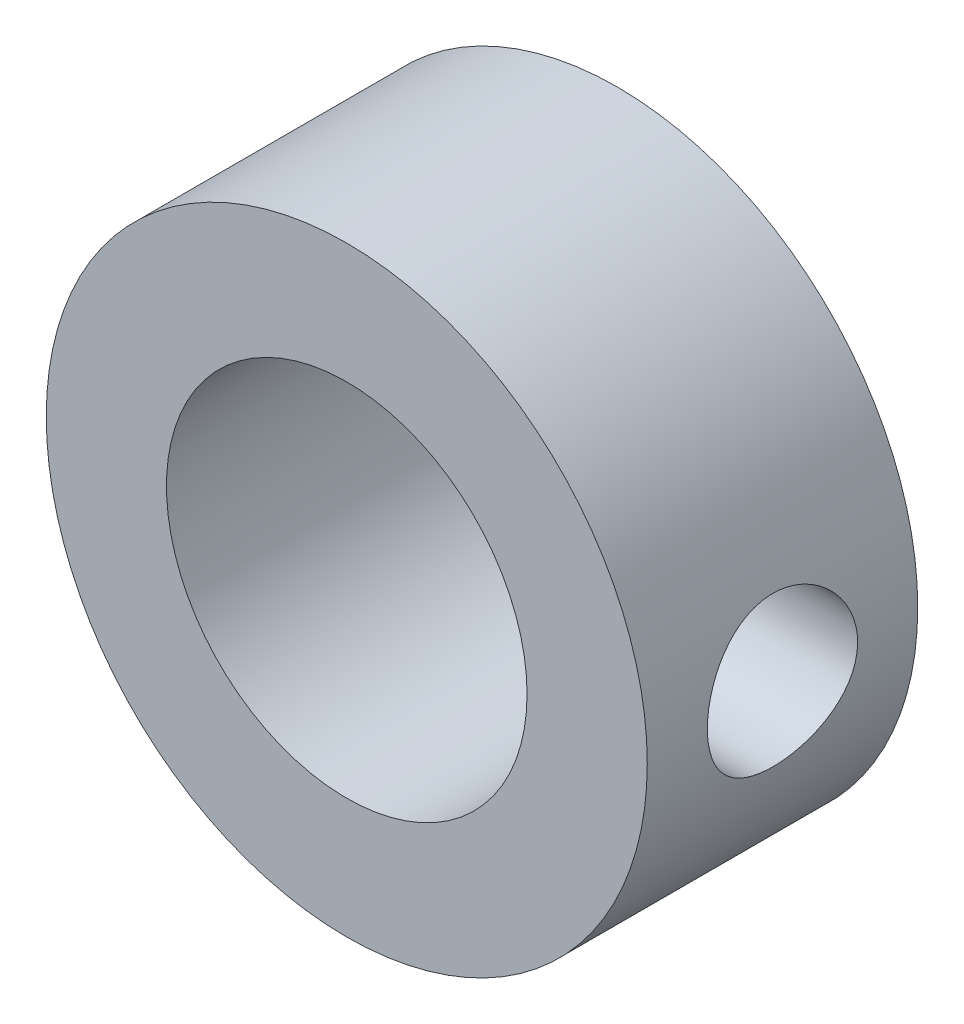
ISO-10303-21;
HEADER;
FILE_DESCRIPTION(('STEP AP214'),'2;1');
FILE_NAME('part.step','',(''),(''),'','','');
FILE_SCHEMA(('AUTOMOTIVE_DESIGN { 1 0 10303 214 1 1 1 1 }'));
ENDSEC;
DATA;
#1=APPLICATION_CONTEXT('core data for automotive mechanical design processes');
#2=APPLICATION_PROTOCOL_DEFINITION('international standard','automotive_design',2000,#1);
#3=PRODUCT_CONTEXT('',#1,'mechanical');
#4=PRODUCT('Part','Part','',(#3));
#5=PRODUCT_RELATED_PRODUCT_CATEGORY('part','',(#4));
#6=PRODUCT_DEFINITION_FORMATION('','',#4);
#7=PRODUCT_DEFINITION_CONTEXT('part definition',#1,'design');
#8=PRODUCT_DEFINITION('design','',#6,#7);
#9=PRODUCT_DEFINITION_SHAPE('','',#8);
#10=(LENGTH_UNIT() NAMED_UNIT(*) SI_UNIT(.MILLI.,.METRE.));
#11=(NAMED_UNIT(*) PLANE_ANGLE_UNIT() SI_UNIT($,.RADIAN.));
#12=(NAMED_UNIT(*) SI_UNIT($,.STERADIAN.) SOLID_ANGLE_UNIT());
#13=UNCERTAINTY_MEASURE_WITH_UNIT(LENGTH_MEASURE(1.E-05),#10,'distance_accuracy_value','');
#14=(GEOMETRIC_REPRESENTATION_CONTEXT(3) GLOBAL_UNCERTAINTY_ASSIGNED_CONTEXT((#13)) GLOBAL_UNIT_ASSIGNED_CONTEXT((#10,
#11,#12)) REPRESENTATION_CONTEXT('',''));
#15=CARTESIAN_POINT('',(0.,0.,0.));
#16=DIRECTION('',(0.,0.,1.));
#17=DIRECTION('',(1.,0.,0.));
#18=AXIS2_PLACEMENT_3D('',#15,#16,#17);
#19=CARTESIAN_POINT('',(0.,0.,0.));
#20=DIRECTION('',(0.,0.,-1.));
#21=DIRECTION('',(-1.,0.,0.));
#22=AXIS2_PLACEMENT_3D('',#19,#20,#21);
#23=PLANE('',#22);
#24=CARTESIAN_POINT('',(0.,0.,0.));
#25=DIRECTION('',(0.,0.,1.));
#26=DIRECTION('',(1.,0.,0.));
#27=AXIS2_PLACEMENT_3D('',#24,#25,#26);
#28=CIRCLE('',#27,9.525);
#29=CARTESIAN_POINT('',(9.52500000000004,0.,0.));
#30=VERTEX_POINT('',#29);
#31=EDGE_CURVE('E48',#30,#30,#28,.T.);
#32=ORIENTED_EDGE('',*,*,#31,.F.);
#33=EDGE_LOOP('',(#32));
#34=FACE_BOUND('',#33,.T.);
#35=CARTESIAN_POINT('',(0.,0.,0.));
#36=DIRECTION('',(0.,0.,1.));
#37=DIRECTION('',(1.,0.,0.));
#38=AXIS2_PLACEMENT_3D('',#35,#36,#37);
#39=CIRCLE('',#38,15.875);
#40=CARTESIAN_POINT('',(15.8750000000001,0.,0.));
#41=VERTEX_POINT('',#40);
#42=EDGE_CURVE('E10',#41,#41,#39,.T.);
#43=ORIENTED_EDGE('',*,*,#42,.T.);
#44=EDGE_LOOP('',(#43));
#45=FACE_BOUND('',#44,.T.);
#46=ADVANCED_FACE('F34',(#34,#45),#23,.F.);
#47=CARTESIAN_POINT('',(0.,0.,-3.30291349825984E-12));
#48=DIRECTION('',(0.,0.,1.));
#49=DIRECTION('',(1.,0.,0.));
#50=AXIS2_PLACEMENT_3D('',#47,#48,#49);
#51=CYLINDRICAL_SURFACE('',#50,15.875);
#52=CARTESIAN_POINT('',(15.875,0.,-11.11275));
#53=CARTESIAN_POINT('',(15.8749962923412,-0.21927631793862,-11.1127438464845));
#54=CARTESIAN_POINT('',(15.8704115464046,-0.438621375927201,-11.0945161052443));
#55=CARTESIAN_POINT('',(15.8525663450826,-0.87102506497622,-11.0221959538335));
#56=CARTESIAN_POINT('',(15.8393009725702,-1.08408006151221,-10.9680832164311));
#57=CARTESIAN_POINT('',(15.8055634467017,-1.49759689098311,-10.8258378085482));
#58=CARTESIAN_POINT('',(15.7850999501961,-1.69807351157523,-10.7377459908992));
#59=CARTESIAN_POINT('',(15.73914555491,-2.08140334899713,-10.5301867388397));
#60=CARTESIAN_POINT('',(15.7136544865579,-2.26425597108945,-10.4107182461019));
#61=CARTESIAN_POINT('',(15.6598253179469,-2.61091343265034,-10.1411979107066));
#62=CARTESIAN_POINT('',(15.6314432932942,-2.77430359661984,-9.99062145792078));
#63=CARTESIAN_POINT('',(15.5753228656204,-3.07379403655877,-9.66428270784481));
#64=CARTESIAN_POINT('',(15.5475845355861,-3.20989123109479,-9.48851757053623));
#65=CARTESIAN_POINT('',(15.4954492736808,-3.45288272782232,-9.11357096259172));
#66=CARTESIAN_POINT('',(15.4711081035481,-3.55931315463522,-8.91408041015188));
#67=CARTESIAN_POINT('',(15.42916371706,-3.73696682054045,-8.49933232748279));
#68=CARTESIAN_POINT('',(15.4115594235815,-3.80819568835206,-8.28407732430904));
#69=CARTESIAN_POINT('',(15.3855334459236,-3.91200967237928,-7.84847032767479));
#70=CARTESIAN_POINT('',(15.3769348659626,-3.94534037662848,-7.62830683756615));
#71=CARTESIAN_POINT('',(15.3693643817434,-3.97473427986315,-7.18535816118923));
#72=CARTESIAN_POINT('',(15.3703909113223,-3.97080354189381,-6.96257340733539));
#73=CARTESIAN_POINT('',(15.3817956459658,-3.92638101310927,-6.52642067534044));
#74=CARTESIAN_POINT('',(15.3919465837346,-3.88677769175432,-6.31295533487303));
#75=CARTESIAN_POINT('',(15.4200941933804,-3.7735514945141,-5.8957988861312));
#76=CARTESIAN_POINT('',(15.4380914241862,-3.69992619505865,-5.69210847531932));
#77=CARTESIAN_POINT('',(15.4801123887539,-3.5199888270422,-5.29790149866626));
#78=CARTESIAN_POINT('',(15.5041951226389,-3.41335430705373,-5.1075386704735));
#79=CARTESIAN_POINT('',(15.5556402661335,-3.1706509802895,-4.74709008043514));
#80=CARTESIAN_POINT('',(15.5830032492704,-3.03457702289009,-4.57700787490541));
#81=CARTESIAN_POINT('',(15.638882672618,-2.73225531113579,-4.25685710014189));
#82=CARTESIAN_POINT('',(15.6674097549388,-2.56525780806384,-4.10749749504606));
#83=CARTESIAN_POINT('',(15.7216995059379,-2.2082440317285,-3.83876879598098));
#84=CARTESIAN_POINT('',(15.7474620901615,-2.01822705560227,-3.71940061809433));
#85=CARTESIAN_POINT('',(15.7934483283255,-1.6195566221362,-3.51378282394798));
#86=CARTESIAN_POINT('',(15.8136526533794,-1.41084139453116,-3.42764837057687));
#87=CARTESIAN_POINT('',(15.8461053037312,-0.981276104878064,-3.2918854619768));
#88=CARTESIAN_POINT('',(15.8583551508518,-0.760428372752367,-3.24225002364369));
#89=CARTESIAN_POINT('',(15.8732934182218,-0.318928671657,-3.18197685779224));
#90=CARTESIAN_POINT('',(15.8762184990732,-0.0984163216355125,-3.17037366017577));
#91=CARTESIAN_POINT('',(15.8728517107157,0.341399481245641,-3.1838463179385));
#92=CARTESIAN_POINT('',(15.8665606711907,0.560703041142987,-3.20891887157273));
#93=CARTESIAN_POINT('',(15.8456201673278,0.9885210861378,-3.29423552845218));
#94=CARTESIAN_POINT('',(15.8310959461656,1.19714729393815,-3.35395292628282));
#95=CARTESIAN_POINT('',(15.7953261963621,1.60140991961395,-3.50626249315863));
#96=CARTESIAN_POINT('',(15.7740799889559,1.79704502327388,-3.59885798224541));
#97=CARTESIAN_POINT('',(15.7266562722145,2.17361329317893,-3.81616642431425));
#98=CARTESIAN_POINT('',(15.7003979490741,2.35422398152381,-3.9414201307159));
#99=CARTESIAN_POINT('',(15.6459901389264,2.69220583193127,-4.21979830035915));
#100=CARTESIAN_POINT('',(15.6178403260695,2.84957297478338,-4.37292757357168));
#101=CARTESIAN_POINT('',(15.5619703195515,3.14057921135844,-4.7071926880657));
#102=CARTESIAN_POINT('',(15.5342776314873,3.27354106641416,-4.88892371418647));
#103=CARTESIAN_POINT('',(15.4832282405322,3.5070805498903,-5.27268842869795));
#104=CARTESIAN_POINT('',(15.4598713451923,3.60765961580221,-5.47472121535876));
#105=CARTESIAN_POINT('',(15.4203954226879,3.77282980035676,-5.89227139053373));
#106=CARTESIAN_POINT('',(15.4042336277388,3.83763413278559,-6.10770018324497));
#107=CARTESIAN_POINT('',(15.3809367690691,3.92997705859968,-6.54686091682346));
#108=CARTESIAN_POINT('',(15.3737997312576,3.95752380186565,-6.77059103082009));
#109=CARTESIAN_POINT('',(15.3695109277681,3.97414377026342,-7.21311187565052));
#110=CARTESIAN_POINT('',(15.3720782188607,3.9642994378693,-7.43185988048439));
#111=CARTESIAN_POINT('',(15.3862592576867,3.90889404885917,-7.86447070547034));
#112=CARTESIAN_POINT('',(15.3978728236181,3.86333371002416,-8.07833362370862));
#113=CARTESIAN_POINT('',(15.4286812726231,3.73838078269606,-8.49392654792961));
#114=CARTESIAN_POINT('',(15.447830611566,3.65919121655118,-8.69572120344427));
#115=CARTESIAN_POINT('',(15.4915593701141,3.4693884172458,-9.08330424176718));
#116=CARTESIAN_POINT('',(15.5161395427503,3.35877082571519,-9.26909039989143));
#117=CARTESIAN_POINT('',(15.5687615732514,3.10585841826935,-9.62461328923345));
#118=CARTESIAN_POINT('',(15.5968770070148,2.96281253520544,-9.79380492343397));
#119=CARTESIAN_POINT('',(15.6529623875501,2.6505677112728,-10.1061348893548));
#120=CARTESIAN_POINT('',(15.680932298193,2.48136256875343,-10.2492670255073));
#121=CARTESIAN_POINT('',(15.7341796390133,2.11790382315061,-10.5079424205771));
#122=CARTESIAN_POINT('',(15.7593991328058,1.92325207571211,-10.6229390820061));
#123=CARTESIAN_POINT('',(15.8036928066328,1.51676644912145,-10.8183943290302));
#124=CARTESIAN_POINT('',(15.8227713875775,1.30494501159302,-10.8988776625493));
#125=CARTESIAN_POINT('',(15.8498132426718,0.911252128373337,-11.0110754677472));
#126=CARTESIAN_POINT('',(15.8591933961858,0.731255868860934,-11.0491209972455));
#127=CARTESIAN_POINT('',(15.8717880967619,0.367522314273116,-11.0999598924997));
#128=CARTESIAN_POINT('',(15.8750031075549,0.183785301621136,-11.112755157537));
#129=CARTESIAN_POINT('',(15.875,0.,-11.11275));
#130=B_SPLINE_CURVE_WITH_KNOTS('',3,(#52,#53,#54,#55,#56,#57,#58,#59,#60,#61,#62,#63,#64,#65,
#66,#67,#68,#69,#70,#71,#72,#73,#74,#75,#76,#77,#78,#79,#80,#81,#82,#83,#84,#85,#86,#87,#88,#89,
#90,#91,#92,#93,#94,#95,#96,#97,#98,#99,#100,#101,#102,#103,#104,#105,#106,#107,#108,#109,#110,
#111,#112,#113,#114,#115,#116,#117,#118,#119,#120,#121,#122,#123,#124,#125,#126,#127,#128,#129),
.UNSPECIFIED.,.T.,.F.,(4,2,2,2,2,2,2,2,2,2,2,2,2,2,2,2,2,2,2,2,2,2,2,2,2,2,2,2,2,2,2,2,2,2,2,2,
2,2,4),(0.,0.657155447581935,1.3146834624171,1.97142338729874,2.62818546669808,3.29709027094104,
3.96607055347254,4.64498921631619,5.32379928510625,5.98901030788251,6.65411309181966,
7.30309523339856,7.9521236126268,8.60770355008425,9.26339827846133,9.93778971322651,
10.6122017446498,11.288930225954,11.9655291997665,12.6248135910374,13.2840386336959,
13.9334947632718,14.5830164938235,15.2440636710878,15.9052250213417,16.5826151394563,
17.2599751836686,17.93325340345,18.6063843237089,19.260179189897,19.9139609171722,
20.5638505983458,21.2138304488326,21.880765876056,22.5478596587194,23.2270349082204,
23.9057223346504,24.4565551780548,25.0073465871825),.UNSPECIFIED.);
#131=CARTESIAN_POINT('',(15.875,0.,-11.11275));
#132=VERTEX_POINT('',#131);
#133=EDGE_CURVE('E53',#132,#132,#130,.T.);
#134=ORIENTED_EDGE('',*,*,#133,.T.);
#135=EDGE_LOOP('',(#134));
#136=FACE_BOUND('',#135,.T.);
#137=ORIENTED_EDGE('',*,*,#42,.F.);
#138=EDGE_LOOP('',(#137));
#139=FACE_BOUND('',#138,.T.);
#140=CARTESIAN_POINT('',(0.,0.,-14.288));
#141=DIRECTION('',(0.,0.,1.));
#142=DIRECTION('',(1.,0.,0.));
#143=AXIS2_PLACEMENT_3D('',#140,#141,#142);
#144=CIRCLE('',#143,15.875);
#145=CARTESIAN_POINT('',(15.8750000000001,0.,-14.288));
#146=VERTEX_POINT('',#145);
#147=EDGE_CURVE('E40',#146,#146,#144,.T.);
#148=ORIENTED_EDGE('',*,*,#147,.T.);
#149=EDGE_LOOP('',(#148));
#150=FACE_BOUND('',#149,.T.);
#151=ADVANCED_FACE('F63',(#136,#139,#150),#51,.T.);
#152=CARTESIAN_POINT('',(0.,15.875,-14.288));
#153=DIRECTION('',(0.,0.,1.));
#154=DIRECTION('',(1.,0.,0.));
#155=AXIS2_PLACEMENT_3D('',#152,#153,#154);
#156=PLANE('',#155);
#157=CARTESIAN_POINT('',(0.,0.,-14.288));
#158=DIRECTION('',(0.,0.,1.));
#159=DIRECTION('',(1.,0.,0.));
#160=AXIS2_PLACEMENT_3D('',#157,#158,#159);
#161=CIRCLE('',#160,9.525);
#162=CARTESIAN_POINT('',(9.52500000000004,0.,-14.288));
#163=VERTEX_POINT('',#162);
#164=EDGE_CURVE('E44',#163,#163,#161,.F.);
#165=ORIENTED_EDGE('',*,*,#164,.F.);
#166=EDGE_LOOP('',(#165));
#167=FACE_BOUND('',#166,.T.);
#168=ORIENTED_EDGE('',*,*,#147,.F.);
#169=EDGE_LOOP('',(#168));
#170=FACE_BOUND('',#169,.T.);
#171=ADVANCED_FACE('F75',(#167,#170),#156,.F.);
#172=CARTESIAN_POINT('',(0.,0.,-14.289));
#173=DIRECTION('',(0.,0.,1.));
#174=DIRECTION('',(1.,0.,0.));
#175=AXIS2_PLACEMENT_3D('',#172,#173,#174);
#176=CYLINDRICAL_SURFACE('',#175,9.525);
#177=CARTESIAN_POINT('',(9.52500000000004,0.,-11.11275));
#178=CARTESIAN_POINT('',(9.52499940431034,0.106339704110733,-11.1127492442008));
#179=CARTESIAN_POINT('',(9.52321418687752,0.212715681361856,-11.1084700133634));
#180=CARTESIAN_POINT('',(9.51611852971385,0.424708606879204,-11.0913942764412));
#181=CARTESIAN_POINT('',(9.51080585924981,0.530325032060763,-11.0785923806776));
#182=CARTESIAN_POINT('',(9.49677884054499,0.740196085308867,-11.0445644371029));
#183=CARTESIAN_POINT('',(9.48805752018965,0.844447466681642,-11.0233211215613));
#184=CARTESIAN_POINT('',(9.46744770745332,1.0506307874672,-10.9726348122429));
#185=CARTESIAN_POINT('',(9.45555792071839,1.15256176045451,-10.9431884672134));
#186=CARTESIAN_POINT('',(9.41566954873616,1.45304856102099,-10.8431862436252));
#187=CARTESIAN_POINT('',(9.38338421186795,1.64725042578752,-10.7608102862458));
#188=CARTESIAN_POINT('',(9.31053593336085,2.01878960760278,-10.5673641905776));
#189=CARTESIAN_POINT('',(9.26997549983865,2.19613201080224,-10.4563027439285));
#190=CARTESIAN_POINT('',(9.18234884287001,2.53824093920417,-10.2027023902316));
#191=CARTESIAN_POINT('',(9.13506952420802,2.70205730367416,-10.0589531686558));
#192=CARTESIAN_POINT('',(9.04026456603981,3.0040561519882,-9.7466709183421));
#193=CARTESIAN_POINT('',(8.99273881029335,3.14222513903647,-9.5781249235905));
#194=CARTESIAN_POINT('',(8.90018838067792,3.39579467666475,-9.21079786086128));
#195=CARTESIAN_POINT('',(8.85540182052122,3.50974047292497,-9.01093718272476));
#196=CARTESIAN_POINT('',(8.7964537212256,3.6538625662617,-8.69755911222673));
#197=CARTESIAN_POINT('',(8.77817079032776,3.69744892615396,-8.59079096419398));
#198=CARTESIAN_POINT('',(8.74497623698359,3.77528941119496,-8.3734168037722));
#199=CARTESIAN_POINT('',(8.73006288201091,3.80954833407462,-8.262812797557));
#200=CARTESIAN_POINT('',(8.70478736192308,3.86694170240058,-8.04395833344947));
#201=CARTESIAN_POINT('',(8.69424199074779,3.89052895323581,-7.93584738940691));
#202=CARTESIAN_POINT('',(8.67709957077966,3.92861373354651,-7.71777111507145));
#203=CARTESIAN_POINT('',(8.67050069736236,3.94311546377097,-7.60780666594539));
#204=CARTESIAN_POINT('',(8.66149391151969,3.96286093875126,-7.38690641123053));
#205=CARTESIAN_POINT('',(8.65908491802955,3.96810707162357,-7.27597086362932));
#206=CARTESIAN_POINT('',(8.65854653232212,3.96928172781079,-7.0540445694244));
#207=CARTESIAN_POINT('',(8.66041691483355,3.96521074158955,-6.94305382603376));
#208=CARTESIAN_POINT('',(8.66805984388479,3.9484732229175,-6.73046625294961));
#209=CARTESIAN_POINT('',(8.67352102353331,3.93649226790053,-6.62880380855354));
#210=CARTESIAN_POINT('',(8.68784624326783,3.9047720831647,-6.42693013361081));
#211=CARTESIAN_POINT('',(8.69671139617197,3.88503031625096,-6.32671938877943));
#212=CARTESIAN_POINT('',(8.72802607625492,3.81443477338009,-6.02933306062093));
#213=CARTESIAN_POINT('',(8.75520186013048,3.75219655480152,-5.83522747466659));
#214=CARTESIAN_POINT('',(8.81971157431984,3.59796791715168,-5.45627279966907));
#215=CARTESIAN_POINT('',(8.85724935772166,3.50537257326446,-5.27170857560905));
#216=CARTESIAN_POINT('',(8.93820695787081,3.29346810049259,-4.91999166126348));
#217=CARTESIAN_POINT('',(8.98162909159074,3.17414843672174,-4.75284587560919));
#218=CARTESIAN_POINT('',(9.07392703271814,2.9003493442931,-4.42588007829252));
#219=CARTESIAN_POINT('',(9.12295360910874,2.74375071631135,-4.26787296396341));
#220=CARTESIAN_POINT('',(9.21784011680501,2.40579154448284,-3.97975281285253));
#221=CARTESIAN_POINT('',(9.26369930462197,2.22442521639881,-3.84964631026432));
#222=CARTESIAN_POINT('',(9.34841550416943,1.83657221137099,-3.61836607035238));
#223=CARTESIAN_POINT('',(9.38708646308534,1.62960234239377,-3.51792946094989));
#224=CARTESIAN_POINT('',(9.4516410345857,1.19968138489649,-3.35393543242827));
#225=CARTESIAN_POINT('',(9.47753171301732,0.976739205259844,-3.29035763174074));
#226=CARTESIAN_POINT('',(9.51228860774909,0.53634675820159,-3.20567921266798));
#227=CARTESIAN_POINT('',(9.52212792826798,0.319440830312385,-3.18214654931838));
#228=CARTESIAN_POINT('',(9.52677959918589,-0.115426030752919,-3.17097574332205));
#229=CARTESIAN_POINT('',(9.52159626384837,-0.33338664309294,-3.18332729531228));
#230=CARTESIAN_POINT('',(9.49741616061335,-0.752786919544943,-3.24183319343969));
#231=CARTESIAN_POINT('',(9.4791176712683,-0.954509669108713,-3.28627960403933));
#232=CARTESIAN_POINT('',(9.43129326502253,-1.34741522795452,-3.40533651788635));
#233=CARTESIAN_POINT('',(9.40176592971959,-1.53859670219198,-3.47995083194981));
#234=CARTESIAN_POINT('',(9.33317509298514,-1.91169607458844,-3.6596628478266));
#235=CARTESIAN_POINT('',(9.29384385415236,-2.09314172700112,-3.76563548148067));
#236=CARTESIAN_POINT('',(9.20984329538344,-2.43632423654929,-4.00409447449672));
#237=CARTESIAN_POINT('',(9.1651717498977,-2.5980528195732,-4.1365919035782));
#238=CARTESIAN_POINT('',(9.07135879069049,-2.90935864105443,-4.43541776566906));
#239=CARTESIAN_POINT('',(9.02212608805479,-3.0572414658275,-4.60348724711156));
#240=CARTESIAN_POINT('',(8.92760269234457,-3.32317676164344,-4.96284255096475));
#241=CARTESIAN_POINT('',(8.88231289601856,-3.44122245828606,-5.15413363117873));
#242=CARTESIAN_POINT('',(8.80050901339694,-3.64540673564478,-5.5584500070842));
#243=CARTESIAN_POINT('',(8.76412911168942,-3.73106690034727,-5.77174606463404));
#244=CARTESIAN_POINT('',(8.70611529160778,-3.86452789664718,-6.21172663347423));
#245=CARTESIAN_POINT('',(8.68446921628959,-3.91235994567542,-6.43839993889391));
#246=CARTESIAN_POINT('',(8.66023047600165,-3.96570453838306,-6.87989937641007));
#247=CARTESIAN_POINT('',(8.65629940020157,-3.97419128243216,-7.09429432600038));
#248=CARTESIAN_POINT('',(8.66437982610699,-3.95654456856176,-7.52132606090521));
#249=CARTESIAN_POINT('',(8.6763888803776,-3.9304164253857,-7.73396311108262));
#250=CARTESIAN_POINT('',(8.71377327866255,-3.84677918968919,-8.14124455560428));
#251=CARTESIAN_POINT('',(8.73850035697027,-3.79078759664355,-8.33626573903109));
#252=CARTESIAN_POINT('',(8.7980259124543,-3.65049901233453,-8.71418966693976));
#253=CARTESIAN_POINT('',(8.83282721922994,-3.56619406749029,-8.89708898893122));
#254=CARTESIAN_POINT('',(8.91117616528716,-3.36582424000279,-9.25758565826455));
#255=CARTESIAN_POINT('',(8.9551238843934,-3.24815448913746,-9.43420295758957));
#256=CARTESIAN_POINT('',(9.04569075374844,-2.98668090348685,-9.76610138158147));
#257=CARTESIAN_POINT('',(9.09231082643895,-2.84286800697567,-9.92137507526119));
#258=CARTESIAN_POINT('',(9.18707098471592,-2.52060299354108,-10.2178903639511));
#259=CARTESIAN_POINT('',(9.235074474669,-2.3403908754022,-10.3572862888568));
#260=CARTESIAN_POINT('',(9.30155622819451,-2.05338852131442,-10.5421749204931));
#261=CARTESIAN_POINT('',(9.32281142897057,-1.9548524836142,-10.5998076538227));
#262=CARTESIAN_POINT('',(9.3628985205544,-1.75280765547819,-10.7065370629352));
#263=CARTESIAN_POINT('',(9.38173152765298,-1.64930118613718,-10.7556376745164));
#264=CARTESIAN_POINT('',(9.41615560801291,-1.43970220933929,-10.8441314311759));
#265=CARTESIAN_POINT('',(9.43179378843127,-1.33367770464092,-10.8836675031179));
#266=CARTESIAN_POINT('',(9.45974893735359,-1.11828343863683,-10.9536233780859));
#267=CARTESIAN_POINT('',(9.47206748086749,-1.00891529125309,-10.9840475050626));
#268=CARTESIAN_POINT('',(9.49300284455447,-0.787917389017952,-11.0354011715979));
#269=CARTESIAN_POINT('',(9.50162880353854,-0.676293942040771,-11.0563541586467));
#270=CARTESIAN_POINT('',(9.51495896057857,-0.451486990346154,-11.088618314061));
#271=CARTESIAN_POINT('',(9.5196660373257,-0.338304692950855,-11.0999365599505));
#272=CARTESIAN_POINT('',(9.52322990511204,-0.187413035354018,-11.1085000806322));
#273=CARTESIAN_POINT('',(9.52389333055183,-0.149952710192037,-11.1100933652437));
#274=CARTESIAN_POINT('',(9.52477848366261,-0.074996427069987,-11.1122184597129));
#275=CARTESIAN_POINT('',(9.52500021006874,-0.0375004690081878,-11.112750266531));
#276=CARTESIAN_POINT('',(9.52500000000004,0.,-11.11275));
#277=B_SPLINE_CURVE_WITH_KNOTS('',3,(#177,#178,#179,#180,#181,#182,#183,#184,#185,#186,#187,
#188,#189,#190,#191,#192,#193,#194,#195,#196,#197,#198,#199,#200,#201,#202,#203,#204,#205,#206,
#207,#208,#209,#210,#211,#212,#213,#214,#215,#216,#217,#218,#219,#220,#221,#222,#223,#224,#225,
#226,#227,#228,#229,#230,#231,#232,#233,#234,#235,#236,#237,#238,#239,#240,#241,#242,#243,#244,
#245,#246,#247,#248,#249,#250,#251,#252,#253,#254,#255,#256,#257,#258,#259,#260,#261,#262,#263,
#264,#265,#266,#267,#268,#269,#270,#271,#272,#273,#274,#275,#276),.UNSPECIFIED.,.T.,.F.,(4,2,2,
2,2,2,2,2,2,2,2,2,2,2,2,2,2,2,2,2,2,2,2,2,2,2,2,2,2,2,2,2,2,2,2,2,2,2,2,2,2,2,2,2,2,2,2,2,2,4),
(0.,0.318980749509838,0.638163412276146,0.958002382820665,1.27797221198545,1.91504647529182,
2.55192793249748,3.21802682265893,3.88447525616337,4.58371459960658,4.93360722716032,
5.28331953982221,5.61634537556035,5.94921712080451,6.28200296637192,6.61477129411307,
6.9219314893138,7.22919218614469,7.84319027634693,8.47025383462212,9.09756502152925,
9.77789117581865,10.4583764857461,11.1545684431888,11.8503750639389,12.5021777727436,
13.1537933129161,13.7730714191171,14.3924277771146,15.031023739899,15.6698867686644,
16.354406689938,17.0390818893888,17.7335092254228,18.4273628896258,19.0678058075266,
19.7081504037047,20.3186850813891,20.9293914096899,21.5768183103766,22.2244700512816,
22.9192921814131,23.2672758934176,23.6150986547657,23.9573486775529,24.2994360319327,
24.6406717865074,24.9816566580068,25.0941442143459,25.206632092803),.UNSPECIFIED.);
#278=CARTESIAN_POINT('',(9.52500000000004,0.,-11.11275));
#279=VERTEX_POINT('',#278);
#280=EDGE_CURVE('E59',#279,#279,#277,.T.);
#281=ORIENTED_EDGE('',*,*,#280,.T.);
#282=EDGE_LOOP('',(#281));
#283=FACE_BOUND('',#282,.T.);
#284=ORIENTED_EDGE('',*,*,#31,.T.);
#285=EDGE_LOOP('',(#284));
#286=FACE_BOUND('',#285,.T.);
#287=ORIENTED_EDGE('',*,*,#164,.T.);
#288=EDGE_LOOP('',(#287));
#289=FACE_BOUND('',#288,.T.);
#290=ADVANCED_FACE('F69',(#283,#286,#289),#176,.F.);
#291=CARTESIAN_POINT('',(15.875,0.,-7.14400000000001));
#292=DIRECTION('',(1.,0.,0.));
#293=DIRECTION('',(0.,0.,-1.));
#294=AXIS2_PLACEMENT_3D('',#291,#292,#293);
#295=CYLINDRICAL_SURFACE('',#294,3.96874999999999);
#296=ORIENTED_EDGE('',*,*,#280,.F.);
#297=EDGE_LOOP('',(#296));
#298=FACE_BOUND('',#297,.T.);
#299=ORIENTED_EDGE('',*,*,#133,.F.);
#300=EDGE_LOOP('',(#299));
#301=FACE_BOUND('',#300,.T.);
#302=ADVANCED_FACE('F66',(#298,#301),#295,.F.);
#303=CLOSED_SHELL('',(#46,#151,#171,#290,#302));
#304=MANIFOLD_SOLID_BREP('B2',#303);
#305=ADVANCED_BREP_SHAPE_REPRESENTATION('',(#18,#304),#14);
#306=SHAPE_DEFINITION_REPRESENTATION(#9,#305);
ENDSEC;
END-ISO-10303-21;
